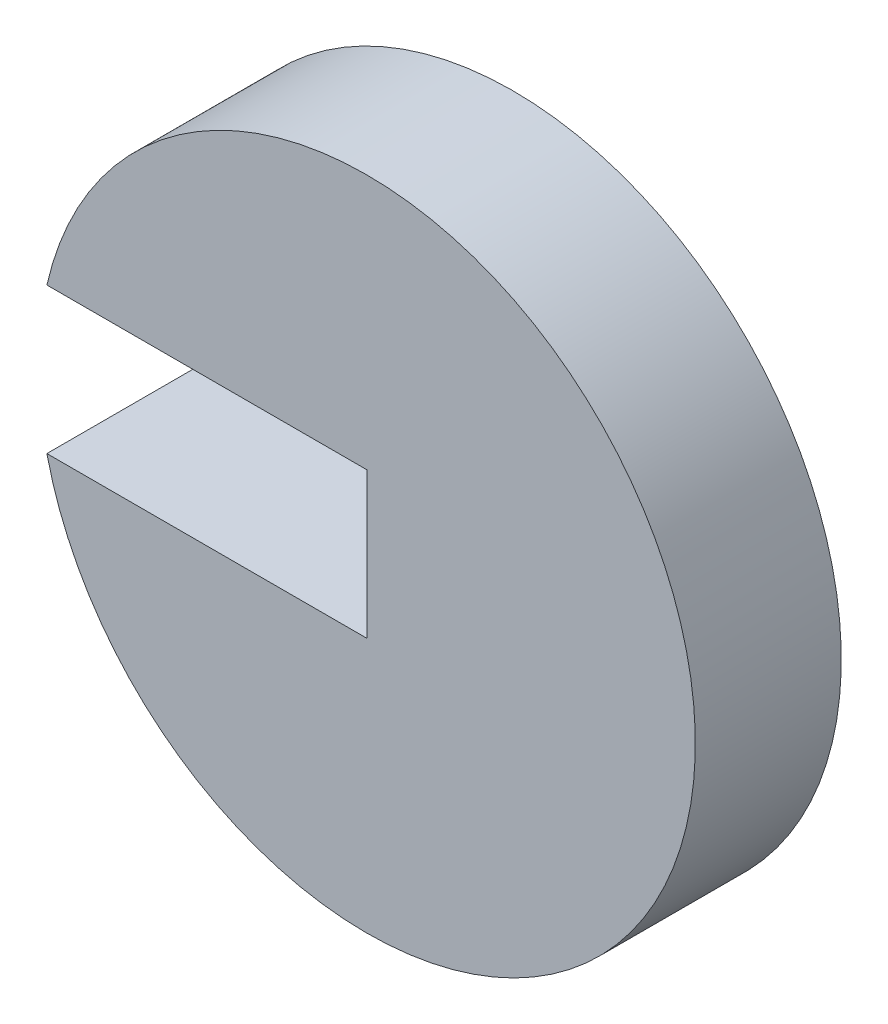
ISO-10303-21;
HEADER;
FILE_DESCRIPTION(('STEP AP214'),'2;1');
FILE_NAME('part.step','',(''),(''),'','','');
FILE_SCHEMA(('AUTOMOTIVE_DESIGN { 1 0 10303 214 1 1 1 1 }'));
ENDSEC;
DATA;
#1=APPLICATION_CONTEXT('core data for automotive mechanical design processes');
#2=APPLICATION_PROTOCOL_DEFINITION('international standard','automotive_design',2000,#1);
#3=PRODUCT_CONTEXT('',#1,'mechanical');
#4=PRODUCT('Part','Part','',(#3));
#5=PRODUCT_RELATED_PRODUCT_CATEGORY('part','',(#4));
#6=PRODUCT_DEFINITION_FORMATION('','',#4);
#7=PRODUCT_DEFINITION_CONTEXT('part definition',#1,'design');
#8=PRODUCT_DEFINITION('design','',#6,#7);
#9=PRODUCT_DEFINITION_SHAPE('','',#8);
#10=(LENGTH_UNIT() NAMED_UNIT(*) SI_UNIT(.MILLI.,.METRE.));
#11=(NAMED_UNIT(*) PLANE_ANGLE_UNIT() SI_UNIT($,.RADIAN.));
#12=(NAMED_UNIT(*) SI_UNIT($,.STERADIAN.) SOLID_ANGLE_UNIT());
#13=UNCERTAINTY_MEASURE_WITH_UNIT(LENGTH_MEASURE(1.E-05),#10,'distance_accuracy_value','');
#14=(GEOMETRIC_REPRESENTATION_CONTEXT(3) GLOBAL_UNCERTAINTY_ASSIGNED_CONTEXT((#13)) GLOBAL_UNIT_ASSIGNED_CONTEXT((#10,
#11,#12)) REPRESENTATION_CONTEXT('',''));
#15=CARTESIAN_POINT('',(0.,0.,0.));
#16=DIRECTION('',(0.,0.,1.));
#17=DIRECTION('',(1.,0.,0.));
#18=AXIS2_PLACEMENT_3D('',#15,#16,#17);
#19=CARTESIAN_POINT('',(0.,-1.5,3.));
#20=DIRECTION('',(0.,-1.,0.));
#21=DIRECTION('',(0.,0.,-1.));
#22=AXIS2_PLACEMENT_3D('',#19,#20,#21);
#23=PLANE('',#22);
#24=DIRECTION('',(-1.,0.,0.));
#25=VECTOR('',#24,1.);
#26=CARTESIAN_POINT('',(0.,-1.5,0.));
#27=LINE('',#26,#25);
#28=CARTESIAN_POINT('',(0.,-1.5,0.));
#29=VERTEX_POINT('',#28);
#30=CARTESIAN_POINT('',(-6.58122329054409,-1.5,0.));
#31=VERTEX_POINT('',#30);
#32=EDGE_CURVE('E96',#29,#31,#27,.T.);
#33=ORIENTED_EDGE('',*,*,#32,.T.);
#34=DIRECTION('',(0.,0.,-1.));
#35=VECTOR('',#34,1.);
#36=CARTESIAN_POINT('',(-6.58122329054409,-1.5,3.));
#37=LINE('',#36,#35);
#38=CARTESIAN_POINT('',(-6.58122329054409,-1.5,3.));
#39=VERTEX_POINT('',#38);
#40=EDGE_CURVE('E11',#39,#31,#37,.T.);
#41=ORIENTED_EDGE('',*,*,#40,.F.);
#42=DIRECTION('',(-1.,0.,0.));
#43=VECTOR('',#42,1.);
#44=CARTESIAN_POINT('',(0.,-1.5,3.));
#45=LINE('',#44,#43);
#46=CARTESIAN_POINT('',(0.,-1.5,3.));
#47=VERTEX_POINT('',#46);
#48=EDGE_CURVE('E84',#47,#39,#45,.T.);
#49=ORIENTED_EDGE('',*,*,#48,.F.);
#50=DIRECTION('',(0.,0.,-1.));
#51=VECTOR('',#50,1.);
#52=CARTESIAN_POINT('',(0.,-1.5,3.));
#53=LINE('',#52,#51);
#54=EDGE_CURVE('E92',#47,#29,#53,.T.);
#55=ORIENTED_EDGE('',*,*,#54,.T.);
#56=EDGE_LOOP('',(#33,#41,#49,#55));
#57=FACE_BOUND('',#56,.T.);
#58=ADVANCED_FACE('F33',(#57),#23,.F.);
#59=CARTESIAN_POINT('',(0.,0.,3.));
#60=DIRECTION('',(0.,0.,-1.));
#61=DIRECTION('',(-1.,0.,0.));
#62=AXIS2_PLACEMENT_3D('',#59,#60,#61);
#63=CYLINDRICAL_SURFACE('',#62,6.75);
#64=CARTESIAN_POINT('',(0.,0.,0.));
#65=DIRECTION('',(0.,0.,1.));
#66=DIRECTION('',(1.,0.,0.));
#67=AXIS2_PLACEMENT_3D('',#64,#65,#66);
#68=CIRCLE('',#67,6.75);
#69=CARTESIAN_POINT('',(-6.58122329054409,1.5,0.));
#70=VERTEX_POINT('',#69);
#71=EDGE_CURVE('E88',#31,#70,#68,.T.);
#72=ORIENTED_EDGE('',*,*,#71,.T.);
#73=DIRECTION('',(0.,0.,-1.));
#74=VECTOR('',#73,1.);
#75=CARTESIAN_POINT('',(-6.58122329054409,1.5,3.));
#76=LINE('',#75,#74);
#77=CARTESIAN_POINT('',(-6.58122329054409,1.5,3.));
#78=VERTEX_POINT('',#77);
#79=EDGE_CURVE('E41',#78,#70,#76,.T.);
#80=ORIENTED_EDGE('',*,*,#79,.F.);
#81=CARTESIAN_POINT('',(0.,0.,3.));
#82=DIRECTION('',(0.,0.,1.));
#83=DIRECTION('',(1.,0.,0.));
#84=AXIS2_PLACEMENT_3D('',#81,#82,#83);
#85=CIRCLE('',#84,6.75);
#86=EDGE_CURVE('E79',#39,#78,#85,.T.);
#87=ORIENTED_EDGE('',*,*,#86,.F.);
#88=ORIENTED_EDGE('',*,*,#40,.T.);
#89=EDGE_LOOP('',(#72,#80,#87,#88));
#90=FACE_BOUND('',#89,.T.);
#91=ADVANCED_FACE('F87',(#90),#63,.T.);
#92=CARTESIAN_POINT('',(0.,1.5,3.));
#93=DIRECTION('',(0.,1.,0.));
#94=DIRECTION('',(0.,0.,1.));
#95=AXIS2_PLACEMENT_3D('',#92,#93,#94);
#96=PLANE('',#95);
#97=DIRECTION('',(1.,0.,0.));
#98=VECTOR('',#97,1.);
#99=CARTESIAN_POINT('',(0.,1.5,0.));
#100=LINE('',#99,#98);
#101=CARTESIAN_POINT('',(0.,1.5,0.));
#102=VERTEX_POINT('',#101);
#103=EDGE_CURVE('E66',#70,#102,#100,.T.);
#104=ORIENTED_EDGE('',*,*,#103,.T.);
#105=DIRECTION('',(0.,0.,-1.));
#106=VECTOR('',#105,1.);
#107=CARTESIAN_POINT('',(0.,1.5,3.));
#108=LINE('',#107,#106);
#109=CARTESIAN_POINT('',(0.,1.5,3.));
#110=VERTEX_POINT('',#109);
#111=EDGE_CURVE('E89',#110,#102,#108,.T.);
#112=ORIENTED_EDGE('',*,*,#111,.F.);
#113=DIRECTION('',(1.,0.,0.));
#114=VECTOR('',#113,1.);
#115=CARTESIAN_POINT('',(0.,1.5,3.));
#116=LINE('',#115,#114);
#117=EDGE_CURVE('E82',#78,#110,#116,.T.);
#118=ORIENTED_EDGE('',*,*,#117,.F.);
#119=ORIENTED_EDGE('',*,*,#79,.T.);
#120=EDGE_LOOP('',(#104,#112,#118,#119));
#121=FACE_BOUND('',#120,.T.);
#122=ADVANCED_FACE('F90',(#121),#96,.F.);
#123=CARTESIAN_POINT('',(0.,-1.5,3.));
#124=DIRECTION('',(1.,0.,0.));
#125=DIRECTION('',(0.,0.,-1.));
#126=AXIS2_PLACEMENT_3D('',#123,#124,#125);
#127=PLANE('',#126);
#128=DIRECTION('',(0.,-1.,0.));
#129=VECTOR('',#128,1.);
#130=CARTESIAN_POINT('',(0.,-1.5,0.));
#131=LINE('',#130,#129);
#132=EDGE_CURVE('E72',#102,#29,#131,.T.);
#133=ORIENTED_EDGE('',*,*,#132,.T.);
#134=ORIENTED_EDGE('',*,*,#54,.F.);
#135=DIRECTION('',(0.,-1.,0.));
#136=VECTOR('',#135,1.);
#137=CARTESIAN_POINT('',(0.,-1.5,3.));
#138=LINE('',#137,#136);
#139=EDGE_CURVE('E49',#110,#47,#138,.T.);
#140=ORIENTED_EDGE('',*,*,#139,.F.);
#141=ORIENTED_EDGE('',*,*,#111,.T.);
#142=EDGE_LOOP('',(#133,#134,#140,#141));
#143=FACE_BOUND('',#142,.T.);
#144=ADVANCED_FACE('F103',(#143),#127,.F.);
#145=CARTESIAN_POINT('',(0.,0.,3.));
#146=DIRECTION('',(0.,0.,1.));
#147=DIRECTION('',(1.,0.,0.));
#148=AXIS2_PLACEMENT_3D('',#145,#146,#147);
#149=PLANE('',#148);
#150=ORIENTED_EDGE('',*,*,#48,.T.);
#151=ORIENTED_EDGE('',*,*,#86,.T.);
#152=ORIENTED_EDGE('',*,*,#117,.T.);
#153=ORIENTED_EDGE('',*,*,#139,.T.);
#154=EDGE_LOOP('',(#150,#151,#152,#153));
#155=FACE_BOUND('',#154,.T.);
#156=ADVANCED_FACE('F80',(#155),#149,.T.);
#157=CARTESIAN_POINT('',(0.,0.,0.));
#158=DIRECTION('',(0.,0.,1.));
#159=DIRECTION('',(1.,0.,0.));
#160=AXIS2_PLACEMENT_3D('',#157,#158,#159);
#161=PLANE('',#160);
#162=ORIENTED_EDGE('',*,*,#32,.F.);
#163=ORIENTED_EDGE('',*,*,#132,.F.);
#164=ORIENTED_EDGE('',*,*,#103,.F.);
#165=ORIENTED_EDGE('',*,*,#71,.F.);
#166=EDGE_LOOP('',(#162,#163,#164,#165));
#167=FACE_BOUND('',#166,.T.);
#168=ADVANCED_FACE('F106',(#167),#161,.F.);
#169=CLOSED_SHELL('',(#58,#91,#122,#144,#156,#168));
#170=MANIFOLD_SOLID_BREP('B2',#169);
#171=ADVANCED_BREP_SHAPE_REPRESENTATION('',(#18,#170),#14);
#172=SHAPE_DEFINITION_REPRESENTATION(#9,#171);
ENDSEC;
END-ISO-10303-21;
